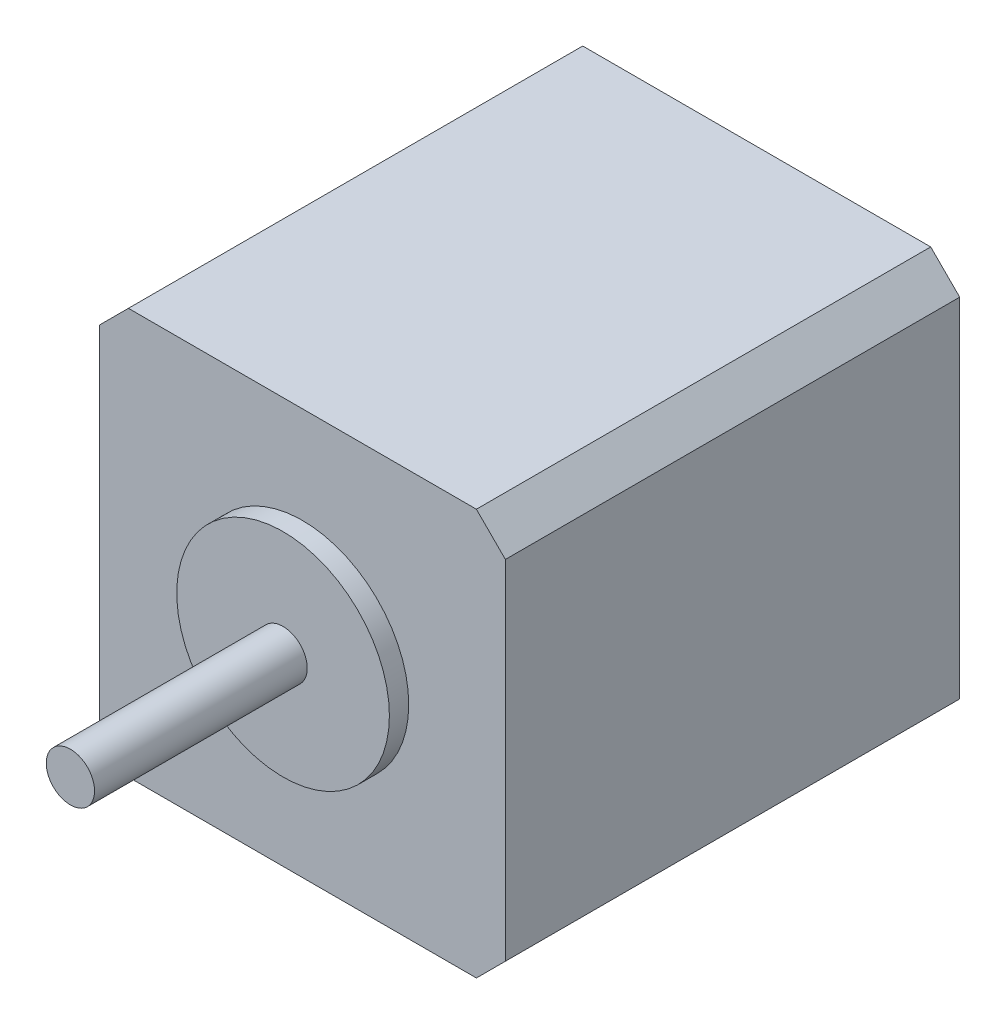
ISO-10303-21;
HEADER;
FILE_DESCRIPTION(('STEP AP214'),'2;1');
FILE_NAME('part.step','',(''),(''),'','','');
FILE_SCHEMA(('AUTOMOTIVE_DESIGN { 1 0 10303 214 1 1 1 1 }'));
ENDSEC;
DATA;
#1=APPLICATION_CONTEXT('core data for automotive mechanical design processes');
#2=APPLICATION_PROTOCOL_DEFINITION('international standard','automotive_design',2000,#1);
#3=PRODUCT_CONTEXT('',#1,'mechanical');
#4=PRODUCT('Part','Part','',(#3));
#5=PRODUCT_RELATED_PRODUCT_CATEGORY('part','',(#4));
#6=PRODUCT_DEFINITION_FORMATION('','',#4);
#7=PRODUCT_DEFINITION_CONTEXT('part definition',#1,'design');
#8=PRODUCT_DEFINITION('design','',#6,#7);
#9=PRODUCT_DEFINITION_SHAPE('','',#8);
#10=(LENGTH_UNIT() NAMED_UNIT(*) SI_UNIT(.MILLI.,.METRE.));
#11=(NAMED_UNIT(*) PLANE_ANGLE_UNIT() SI_UNIT($,.RADIAN.));
#12=(NAMED_UNIT(*) SI_UNIT($,.STERADIAN.) SOLID_ANGLE_UNIT());
#13=UNCERTAINTY_MEASURE_WITH_UNIT(LENGTH_MEASURE(1.E-05),#10,'distance_accuracy_value','');
#14=(GEOMETRIC_REPRESENTATION_CONTEXT(3) GLOBAL_UNCERTAINTY_ASSIGNED_CONTEXT((#13)) GLOBAL_UNIT_ASSIGNED_CONTEXT((#10,
#11,#12)) REPRESENTATION_CONTEXT('',''));
#15=CARTESIAN_POINT('',(0.,0.,0.));
#16=DIRECTION('',(0.,0.,1.));
#17=DIRECTION('',(1.,0.,0.));
#18=AXIS2_PLACEMENT_3D('',#15,#16,#17);
#19=CARTESIAN_POINT('',(-21.,21.,49.));
#20=DIRECTION('',(0.,0.,1.));
#21=DIRECTION('',(1.,0.,0.));
#22=AXIS2_PLACEMENT_3D('',#19,#20,#21);
#23=PLANE('',#22);
#24=CARTESIAN_POINT('',(-21.,21.,49.));
#25=DIRECTION('',(0.,0.,1.));
#26=DIRECTION('',(1.,0.,0.));
#27=AXIS2_PLACEMENT_3D('',#24,#25,#26);
#28=CIRCLE('',#27,11.);
#29=CARTESIAN_POINT('',(-10.,21.,49.));
#30=VERTEX_POINT('',#29);
#31=EDGE_CURVE('E161',#30,#30,#28,.T.);
#32=ORIENTED_EDGE('',*,*,#31,.T.);
#33=EDGE_LOOP('',(#32));
#34=FACE_BOUND('',#33,.T.);
#35=CARTESIAN_POINT('',(-21.,21.,49.));
#36=DIRECTION('',(0.,0.,1.));
#37=DIRECTION('',(1.,0.,0.));
#38=AXIS2_PLACEMENT_3D('',#35,#36,#37);
#39=CIRCLE('',#38,2.5);
#40=CARTESIAN_POINT('',(-18.5,21.,49.));
#41=VERTEX_POINT('',#40);
#42=EDGE_CURVE('E175',#41,#41,#39,.T.);
#43=ORIENTED_EDGE('',*,*,#42,.F.);
#44=EDGE_LOOP('',(#43));
#45=FACE_BOUND('',#44,.T.);
#46=ADVANCED_FACE('F35',(#34,#45),#23,.T.);
#47=CARTESIAN_POINT('',(0.,0.,47.));
#48=DIRECTION('',(0.,0.,1.));
#49=DIRECTION('',(1.,0.,0.));
#50=AXIS2_PLACEMENT_3D('',#47,#48,#49);
#51=PLANE('',#50);
#52=DIRECTION('',(0.,-1.,0.));
#53=VECTOR('',#52,1.);
#54=CARTESIAN_POINT('',(-42.,0.,47.));
#55=LINE('',#54,#53);
#56=CARTESIAN_POINT('',(-42.,39.,47.));
#57=VERTEX_POINT('',#56);
#58=CARTESIAN_POINT('',(-42.,3.00000000000001,47.));
#59=VERTEX_POINT('',#58);
#60=EDGE_CURVE('E165',#57,#59,#55,.T.);
#61=ORIENTED_EDGE('',*,*,#60,.T.);
#62=DIRECTION('',(-0.707106781186545,0.70710678118655,0.));
#63=VECTOR('',#62,1.);
#64=CARTESIAN_POINT('',(-19.5000000000001,-19.5,47.));
#65=LINE('',#64,#63);
#66=CARTESIAN_POINT('',(-39.,0.,47.));
#67=VERTEX_POINT('',#66);
#68=EDGE_CURVE('E148',#59,#67,#65,.F.);
#69=ORIENTED_EDGE('',*,*,#68,.T.);
#70=DIRECTION('',(1.,0.,0.));
#71=VECTOR('',#70,1.);
#72=CARTESIAN_POINT('',(0.,0.,47.));
#73=LINE('',#72,#71);
#74=CARTESIAN_POINT('',(-3.00000000000001,0.,47.));
#75=VERTEX_POINT('',#74);
#76=EDGE_CURVE('E120',#67,#75,#73,.T.);
#77=ORIENTED_EDGE('',*,*,#76,.T.);
#78=DIRECTION('',(-0.70710678118655,-0.707106781186545,0.));
#79=VECTOR('',#78,1.);
#80=CARTESIAN_POINT('',(-1.49999999999999,1.5,47.));
#81=LINE('',#80,#79);
#82=CARTESIAN_POINT('',(0.,2.99999999999999,47.));
#83=VERTEX_POINT('',#82);
#84=EDGE_CURVE('E146',#75,#83,#81,.F.);
#85=ORIENTED_EDGE('',*,*,#84,.T.);
#86=DIRECTION('',(0.,1.,0.));
#87=VECTOR('',#86,1.);
#88=CARTESIAN_POINT('',(0.,0.,47.));
#89=LINE('',#88,#87);
#90=CARTESIAN_POINT('',(0.,39.,47.));
#91=VERTEX_POINT('',#90);
#92=EDGE_CURVE('E126',#83,#91,#89,.T.);
#93=ORIENTED_EDGE('',*,*,#92,.T.);
#94=DIRECTION('',(0.707106781186546,-0.707106781186549,0.));
#95=VECTOR('',#94,1.);
#96=CARTESIAN_POINT('',(19.5,19.4999999999999,47.));
#97=LINE('',#96,#95);
#98=CARTESIAN_POINT('',(-3.,42.,47.));
#99=VERTEX_POINT('',#98);
#100=EDGE_CURVE('E55',#91,#99,#97,.F.);
#101=ORIENTED_EDGE('',*,*,#100,.T.);
#102=DIRECTION('',(-1.,0.,0.));
#103=VECTOR('',#102,1.);
#104=CARTESIAN_POINT('',(0.,42.,47.));
#105=LINE('',#104,#103);
#106=CARTESIAN_POINT('',(-39.,42.,47.));
#107=VERTEX_POINT('',#106);
#108=EDGE_CURVE('E129',#99,#107,#105,.T.);
#109=ORIENTED_EDGE('',*,*,#108,.T.);
#110=DIRECTION('',(0.707106781186551,0.707106781186544,0.));
#111=VECTOR('',#110,1.);
#112=CARTESIAN_POINT('',(-40.4999999999998,40.5000000000002,47.));
#113=LINE('',#112,#111);
#114=EDGE_CURVE('E144',#107,#57,#113,.F.);
#115=ORIENTED_EDGE('',*,*,#114,.T.);
#116=EDGE_LOOP('',(#61,#69,#77,#85,#93,#101,#109,#115));
#117=FACE_BOUND('',#116,.T.);
#118=CARTESIAN_POINT('',(-21.,21.,47.));
#119=DIRECTION('',(0.,0.,1.));
#120=DIRECTION('',(1.,0.,0.));
#121=AXIS2_PLACEMENT_3D('',#118,#119,#120);
#122=CIRCLE('',#121,11.);
#123=CARTESIAN_POINT('',(-10.,21.,47.));
#124=VERTEX_POINT('',#123);
#125=EDGE_CURVE('E169',#124,#124,#122,.T.);
#126=ORIENTED_EDGE('',*,*,#125,.F.);
#127=EDGE_LOOP('',(#126));
#128=FACE_BOUND('',#127,.T.);
#129=ADVANCED_FACE('F191',(#117,#128),#51,.T.);
#130=CARTESIAN_POINT('',(0.,0.,47.));
#131=DIRECTION('',(-1.,0.,0.));
#132=DIRECTION('',(0.,0.,1.));
#133=AXIS2_PLACEMENT_3D('',#130,#131,#132);
#134=PLANE('',#133);
#135=ORIENTED_EDGE('',*,*,#92,.F.);
#136=DIRECTION('',(0.,0.,-1.));
#137=VECTOR('',#136,1.);
#138=CARTESIAN_POINT('',(0.,2.99999999999999,47.));
#139=LINE('',#138,#137);
#140=CARTESIAN_POINT('',(0.,2.99999999999999,0.));
#141=VERTEX_POINT('',#140);
#142=EDGE_CURVE('E152',#83,#141,#139,.T.);
#143=ORIENTED_EDGE('',*,*,#142,.T.);
#144=DIRECTION('',(0.,1.,0.));
#145=VECTOR('',#144,1.);
#146=CARTESIAN_POINT('',(0.,0.,0.));
#147=LINE('',#146,#145);
#148=CARTESIAN_POINT('',(0.,39.,0.));
#149=VERTEX_POINT('',#148);
#150=EDGE_CURVE('E160',#141,#149,#147,.T.);
#151=ORIENTED_EDGE('',*,*,#150,.T.);
#152=DIRECTION('',(0.,0.,1.));
#153=VECTOR('',#152,1.);
#154=CARTESIAN_POINT('',(0.,39.,47.));
#155=LINE('',#154,#153);
#156=EDGE_CURVE('E150',#149,#91,#155,.T.);
#157=ORIENTED_EDGE('',*,*,#156,.T.);
#158=EDGE_LOOP('',(#135,#143,#151,#157));
#159=FACE_BOUND('',#158,.T.);
#160=ADVANCED_FACE('F197',(#159),#134,.F.);
#161=CARTESIAN_POINT('',(0.,42.,47.));
#162=DIRECTION('',(0.,-1.,0.));
#163=DIRECTION('',(0.,0.,-1.));
#164=AXIS2_PLACEMENT_3D('',#161,#162,#163);
#165=PLANE('',#164);
#166=DIRECTION('',(-1.,0.,0.));
#167=VECTOR('',#166,1.);
#168=CARTESIAN_POINT('',(0.,42.,0.));
#169=LINE('',#168,#167);
#170=CARTESIAN_POINT('',(-3.,42.,0.));
#171=VERTEX_POINT('',#170);
#172=CARTESIAN_POINT('',(-39.,42.,0.));
#173=VERTEX_POINT('',#172);
#174=EDGE_CURVE('E131',#171,#173,#169,.T.);
#175=ORIENTED_EDGE('',*,*,#174,.T.);
#176=DIRECTION('',(0.,0.,1.));
#177=VECTOR('',#176,1.);
#178=CARTESIAN_POINT('',(-39.,42.,47.));
#179=LINE('',#178,#177);
#180=EDGE_CURVE('E11',#173,#107,#179,.T.);
#181=ORIENTED_EDGE('',*,*,#180,.T.);
#182=ORIENTED_EDGE('',*,*,#108,.F.);
#183=DIRECTION('',(0.,0.,-1.));
#184=VECTOR('',#183,1.);
#185=CARTESIAN_POINT('',(-3.,42.,47.));
#186=LINE('',#185,#184);
#187=EDGE_CURVE('E43',#99,#171,#186,.T.);
#188=ORIENTED_EDGE('',*,*,#187,.T.);
#189=EDGE_LOOP('',(#175,#181,#182,#188));
#190=FACE_BOUND('',#189,.T.);
#191=ADVANCED_FACE('F157',(#190),#165,.F.);
#192=CARTESIAN_POINT('',(-42.,0.,47.));
#193=DIRECTION('',(1.,0.,0.));
#194=DIRECTION('',(0.,0.,-1.));
#195=AXIS2_PLACEMENT_3D('',#192,#193,#194);
#196=PLANE('',#195);
#197=DIRECTION('',(0.,-1.,0.));
#198=VECTOR('',#197,1.);
#199=CARTESIAN_POINT('',(-42.,0.,0.));
#200=LINE('',#199,#198);
#201=CARTESIAN_POINT('',(-42.,39.,0.));
#202=VERTEX_POINT('',#201);
#203=CARTESIAN_POINT('',(-42.,3.00000000000001,0.));
#204=VERTEX_POINT('',#203);
#205=EDGE_CURVE('E127',#202,#204,#200,.T.);
#206=ORIENTED_EDGE('',*,*,#205,.T.);
#207=DIRECTION('',(0.,0.,1.));
#208=VECTOR('',#207,1.);
#209=CARTESIAN_POINT('',(-42.,3.00000000000001,47.));
#210=LINE('',#209,#208);
#211=EDGE_CURVE('E105',#204,#59,#210,.T.);
#212=ORIENTED_EDGE('',*,*,#211,.T.);
#213=ORIENTED_EDGE('',*,*,#60,.F.);
#214=DIRECTION('',(0.,0.,-1.));
#215=VECTOR('',#214,1.);
#216=CARTESIAN_POINT('',(-42.,39.,47.));
#217=LINE('',#216,#215);
#218=EDGE_CURVE('E110',#57,#202,#217,.T.);
#219=ORIENTED_EDGE('',*,*,#218,.T.);
#220=EDGE_LOOP('',(#206,#212,#213,#219));
#221=FACE_BOUND('',#220,.T.);
#222=ADVANCED_FACE('F208',(#221),#196,.F.);
#223=CARTESIAN_POINT('',(0.,0.,47.));
#224=DIRECTION('',(0.,1.,0.));
#225=DIRECTION('',(-1.,0.,0.));
#226=AXIS2_PLACEMENT_3D('',#223,#224,#225);
#227=PLANE('',#226);
#228=ORIENTED_EDGE('',*,*,#76,.F.);
#229=DIRECTION('',(0.,0.,-1.));
#230=VECTOR('',#229,1.);
#231=CARTESIAN_POINT('',(-39.,0.,47.));
#232=LINE('',#231,#230);
#233=CARTESIAN_POINT('',(-39.,0.,0.));
#234=VERTEX_POINT('',#233);
#235=EDGE_CURVE('E104',#67,#234,#232,.T.);
#236=ORIENTED_EDGE('',*,*,#235,.T.);
#237=DIRECTION('',(1.,0.,0.));
#238=VECTOR('',#237,1.);
#239=CARTESIAN_POINT('',(0.,0.,0.));
#240=LINE('',#239,#238);
#241=CARTESIAN_POINT('',(-3.00000000000001,0.,0.));
#242=VERTEX_POINT('',#241);
#243=EDGE_CURVE('E117',#234,#242,#240,.T.);
#244=ORIENTED_EDGE('',*,*,#243,.T.);
#245=DIRECTION('',(0.,0.,1.));
#246=VECTOR('',#245,1.);
#247=CARTESIAN_POINT('',(-3.00000000000001,0.,47.));
#248=LINE('',#247,#246);
#249=EDGE_CURVE('E122',#242,#75,#248,.T.);
#250=ORIENTED_EDGE('',*,*,#249,.T.);
#251=EDGE_LOOP('',(#228,#236,#244,#250));
#252=FACE_BOUND('',#251,.T.);
#253=ADVANCED_FACE('F116',(#252),#227,.F.);
#254=CARTESIAN_POINT('',(0.,0.,0.));
#255=DIRECTION('',(0.,0.,1.));
#256=DIRECTION('',(1.,0.,0.));
#257=AXIS2_PLACEMENT_3D('',#254,#255,#256);
#258=PLANE('',#257);
#259=ORIENTED_EDGE('',*,*,#243,.F.);
#260=DIRECTION('',(0.707106781186545,-0.70710678118655,0.));
#261=VECTOR('',#260,1.);
#262=CARTESIAN_POINT('',(-39.,0.,0.));
#263=LINE('',#262,#261);
#264=EDGE_CURVE('E100',#234,#204,#263,.F.);
#265=ORIENTED_EDGE('',*,*,#264,.T.);
#266=ORIENTED_EDGE('',*,*,#205,.F.);
#267=DIRECTION('',(-0.707106781186551,-0.707106781186544,0.));
#268=VECTOR('',#267,1.);
#269=CARTESIAN_POINT('',(-42.,39.,0.));
#270=LINE('',#269,#268);
#271=EDGE_CURVE('E137',#202,#173,#270,.F.);
#272=ORIENTED_EDGE('',*,*,#271,.T.);
#273=ORIENTED_EDGE('',*,*,#174,.F.);
#274=DIRECTION('',(-0.707106781186546,0.707106781186549,0.));
#275=VECTOR('',#274,1.);
#276=CARTESIAN_POINT('',(-3.,42.,0.));
#277=LINE('',#276,#275);
#278=EDGE_CURVE('E121',#171,#149,#277,.F.);
#279=ORIENTED_EDGE('',*,*,#278,.T.);
#280=ORIENTED_EDGE('',*,*,#150,.F.);
#281=DIRECTION('',(0.70710678118655,0.707106781186545,0.));
#282=VECTOR('',#281,1.);
#283=CARTESIAN_POINT('',(0.,2.99999999999999,0.));
#284=LINE('',#283,#282);
#285=EDGE_CURVE('E111',#141,#242,#284,.F.);
#286=ORIENTED_EDGE('',*,*,#285,.T.);
#287=EDGE_LOOP('',(#259,#265,#266,#272,#273,#279,#280,#286));
#288=FACE_BOUND('',#287,.T.);
#289=ADVANCED_FACE('F124',(#288),#258,.F.);
#290=CARTESIAN_POINT('',(-39.,0.,47.));
#291=DIRECTION('',(0.70710678118655,0.707106781186545,0.));
#292=DIRECTION('',(0.,0.,-1.));
#293=AXIS2_PLACEMENT_3D('',#290,#291,#292);
#294=PLANE('',#293);
#295=ORIENTED_EDGE('',*,*,#68,.F.);
#296=ORIENTED_EDGE('',*,*,#211,.F.);
#297=ORIENTED_EDGE('',*,*,#264,.F.);
#298=ORIENTED_EDGE('',*,*,#235,.F.);
#299=EDGE_LOOP('',(#295,#296,#297,#298));
#300=FACE_BOUND('',#299,.T.);
#301=ADVANCED_FACE('F103',(#300),#294,.F.);
#302=CARTESIAN_POINT('',(0.,2.99999999999999,47.));
#303=DIRECTION('',(-0.707106781186545,0.70710678118655,0.));
#304=DIRECTION('',(0.,0.,-1.));
#305=AXIS2_PLACEMENT_3D('',#302,#303,#304);
#306=PLANE('',#305);
#307=ORIENTED_EDGE('',*,*,#84,.F.);
#308=ORIENTED_EDGE('',*,*,#249,.F.);
#309=ORIENTED_EDGE('',*,*,#285,.F.);
#310=ORIENTED_EDGE('',*,*,#142,.F.);
#311=EDGE_LOOP('',(#307,#308,#309,#310));
#312=FACE_BOUND('',#311,.T.);
#313=ADVANCED_FACE('F219',(#312),#306,.F.);
#314=CARTESIAN_POINT('',(-42.,39.,47.));
#315=DIRECTION('',(0.707106781186544,-0.707106781186551,0.));
#316=DIRECTION('',(0.,0.,-1.));
#317=AXIS2_PLACEMENT_3D('',#314,#315,#316);
#318=PLANE('',#317);
#319=ORIENTED_EDGE('',*,*,#114,.F.);
#320=ORIENTED_EDGE('',*,*,#180,.F.);
#321=ORIENTED_EDGE('',*,*,#271,.F.);
#322=ORIENTED_EDGE('',*,*,#218,.F.);
#323=EDGE_LOOP('',(#319,#320,#321,#322));
#324=FACE_BOUND('',#323,.T.);
#325=ADVANCED_FACE('F221',(#324),#318,.F.);
#326=CARTESIAN_POINT('',(-3.,42.,47.));
#327=DIRECTION('',(-0.707106781186549,-0.707106781186546,0.));
#328=DIRECTION('',(0.,0.,-1.));
#329=AXIS2_PLACEMENT_3D('',#326,#327,#328);
#330=PLANE('',#329);
#331=ORIENTED_EDGE('',*,*,#100,.F.);
#332=ORIENTED_EDGE('',*,*,#156,.F.);
#333=ORIENTED_EDGE('',*,*,#278,.F.);
#334=ORIENTED_EDGE('',*,*,#187,.F.);
#335=EDGE_LOOP('',(#331,#332,#333,#334));
#336=FACE_BOUND('',#335,.T.);
#337=ADVANCED_FACE('F37',(#336),#330,.F.);
#338=CARTESIAN_POINT('',(-21.,21.,49.));
#339=DIRECTION('',(0.,0.,-1.));
#340=DIRECTION('',(-1.,0.,0.));
#341=AXIS2_PLACEMENT_3D('',#338,#339,#340);
#342=CYLINDRICAL_SURFACE('',#341,11.);
#343=ORIENTED_EDGE('',*,*,#31,.F.);
#344=EDGE_LOOP('',(#343));
#345=FACE_BOUND('',#344,.T.);
#346=ORIENTED_EDGE('',*,*,#125,.T.);
#347=EDGE_LOOP('',(#346));
#348=FACE_BOUND('',#347,.T.);
#349=ADVANCED_FACE('F186',(#345,#348),#342,.T.);
#350=CARTESIAN_POINT('',(-21.,21.,71.));
#351=DIRECTION('',(0.,0.,-1.));
#352=DIRECTION('',(-1.,0.,0.));
#353=AXIS2_PLACEMENT_3D('',#350,#351,#352);
#354=CYLINDRICAL_SURFACE('',#353,2.5);
#355=CARTESIAN_POINT('',(-21.,21.,71.));
#356=DIRECTION('',(0.,0.,1.));
#357=DIRECTION('',(1.,0.,0.));
#358=AXIS2_PLACEMENT_3D('',#355,#356,#357);
#359=CIRCLE('',#358,2.5);
#360=CARTESIAN_POINT('',(-18.5,21.,71.));
#361=VERTEX_POINT('',#360);
#362=EDGE_CURVE('E172',#361,#361,#359,.T.);
#363=ORIENTED_EDGE('',*,*,#362,.F.);
#364=EDGE_LOOP('',(#363));
#365=FACE_BOUND('',#364,.T.);
#366=ORIENTED_EDGE('',*,*,#42,.T.);
#367=EDGE_LOOP('',(#366));
#368=FACE_BOUND('',#367,.T.);
#369=ADVANCED_FACE('F183',(#365,#368),#354,.T.);
#370=CARTESIAN_POINT('',(-21.,21.,71.));
#371=DIRECTION('',(0.,0.,1.));
#372=DIRECTION('',(1.,0.,0.));
#373=AXIS2_PLACEMENT_3D('',#370,#371,#372);
#374=PLANE('',#373);
#375=ORIENTED_EDGE('',*,*,#362,.T.);
#376=EDGE_LOOP('',(#375));
#377=FACE_BOUND('',#376,.T.);
#378=ADVANCED_FACE('F181',(#377),#374,.T.);
#379=CLOSED_SHELL('',(#46,#129,#160,#191,#222,#253,#289,#301,#313,#325,#337,#349,#369,#378));
#380=MANIFOLD_SOLID_BREP('B2',#379);
#381=ADVANCED_BREP_SHAPE_REPRESENTATION('',(#18,#380),#14);
#382=SHAPE_DEFINITION_REPRESENTATION(#9,#381);
ENDSEC;
END-ISO-10303-21;
